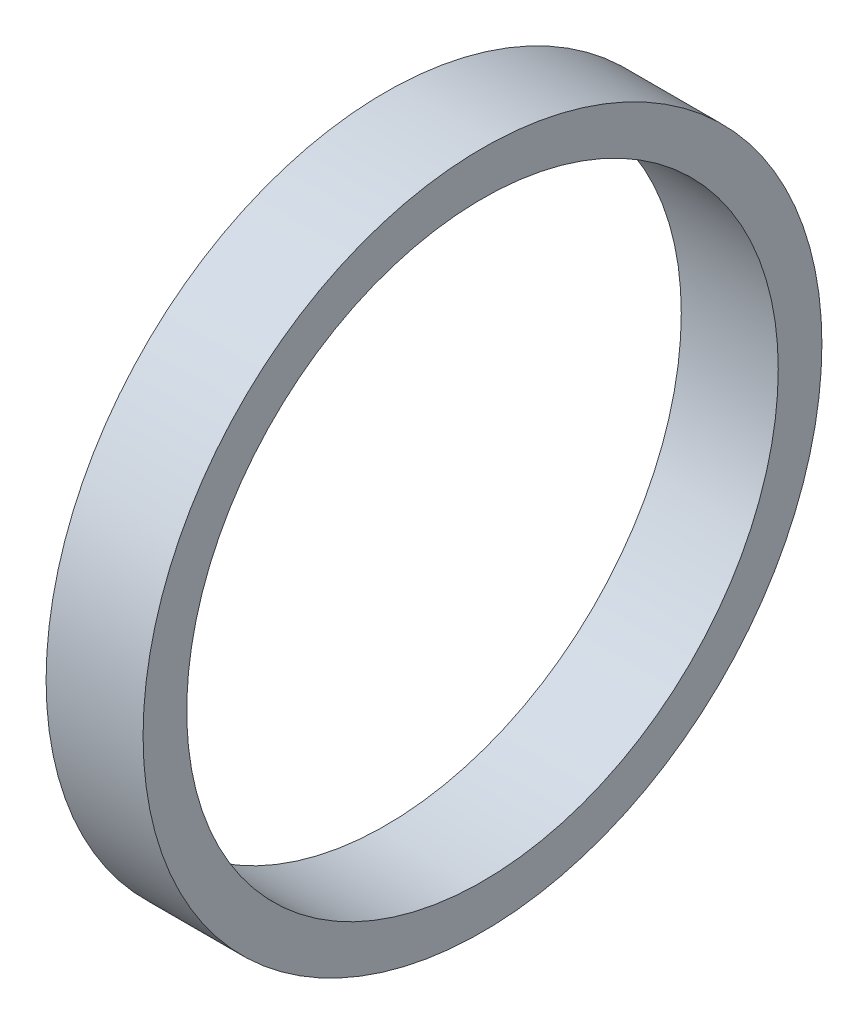
ISO-10303-21;
HEADER;
FILE_DESCRIPTION(('STEP AP214'),'2;1');
FILE_NAME('part.step','',(''),(''),'','','');
FILE_SCHEMA(('AUTOMOTIVE_DESIGN { 1 0 10303 214 1 1 1 1 }'));
ENDSEC;
DATA;
#1=APPLICATION_CONTEXT('core data for automotive mechanical design processes');
#2=APPLICATION_PROTOCOL_DEFINITION('international standard','automotive_design',2000,#1);
#3=PRODUCT_CONTEXT('',#1,'mechanical');
#4=PRODUCT('Part','Part','',(#3));
#5=PRODUCT_RELATED_PRODUCT_CATEGORY('part','',(#4));
#6=PRODUCT_DEFINITION_FORMATION('','',#4);
#7=PRODUCT_DEFINITION_CONTEXT('part definition',#1,'design');
#8=PRODUCT_DEFINITION('design','',#6,#7);
#9=PRODUCT_DEFINITION_SHAPE('','',#8);
#10=(LENGTH_UNIT() NAMED_UNIT(*) SI_UNIT(.MILLI.,.METRE.));
#11=(NAMED_UNIT(*) PLANE_ANGLE_UNIT() SI_UNIT($,.RADIAN.));
#12=(NAMED_UNIT(*) SI_UNIT($,.STERADIAN.) SOLID_ANGLE_UNIT());
#13=UNCERTAINTY_MEASURE_WITH_UNIT(LENGTH_MEASURE(1.E-05),#10,'distance_accuracy_value','');
#14=(GEOMETRIC_REPRESENTATION_CONTEXT(3) GLOBAL_UNCERTAINTY_ASSIGNED_CONTEXT((#13)) GLOBAL_UNIT_ASSIGNED_CONTEXT((#10,
#11,#12)) REPRESENTATION_CONTEXT('',''));
#15=CARTESIAN_POINT('',(0.,0.,0.));
#16=DIRECTION('',(0.,0.,1.));
#17=DIRECTION('',(1.,0.,0.));
#18=AXIS2_PLACEMENT_3D('',#15,#16,#17);
#19=CARTESIAN_POINT('',(1.,0.,0.));
#20=DIRECTION('',(1.,0.,0.));
#21=DIRECTION('',(0.,0.,-1.));
#22=AXIS2_PLACEMENT_3D('',#19,#20,#21);
#23=PLANE('',#22);
#24=CARTESIAN_POINT('',(1.,0.,0.));
#25=DIRECTION('',(1.,0.,0.));
#26=DIRECTION('',(0.,0.,-1.));
#27=AXIS2_PLACEMENT_3D('',#24,#25,#26);
#28=CIRCLE('',#27,3.5);
#29=CARTESIAN_POINT('',(1.,0.,-3.5));
#30=VERTEX_POINT('',#29);
#31=EDGE_CURVE('E10',#30,#30,#28,.T.);
#32=ORIENTED_EDGE('',*,*,#31,.T.);
#33=EDGE_LOOP('',(#32));
#34=FACE_BOUND('',#33,.T.);
#35=CARTESIAN_POINT('',(1.,0.,0.));
#36=DIRECTION('',(1.,0.,0.));
#37=DIRECTION('',(0.,0.,-1.));
#38=AXIS2_PLACEMENT_3D('',#35,#36,#37);
#39=CIRCLE('',#38,3.05);
#40=CARTESIAN_POINT('',(1.,0.,-3.05));
#41=VERTEX_POINT('',#40);
#42=EDGE_CURVE('E50',#41,#41,#39,.T.);
#43=ORIENTED_EDGE('',*,*,#42,.F.);
#44=EDGE_LOOP('',(#43));
#45=FACE_BOUND('',#44,.T.);
#46=ADVANCED_FACE('F39',(#34,#45),#23,.T.);
#47=CARTESIAN_POINT('',(0.,0.,0.));
#48=DIRECTION('',(1.,0.,0.));
#49=DIRECTION('',(0.,0.,-1.));
#50=AXIS2_PLACEMENT_3D('',#47,#48,#49);
#51=PLANE('',#50);
#52=CARTESIAN_POINT('',(0.,0.,0.));
#53=DIRECTION('',(1.,0.,0.));
#54=DIRECTION('',(0.,0.,-1.));
#55=AXIS2_PLACEMENT_3D('',#52,#53,#54);
#56=CIRCLE('',#55,3.5);
#57=CARTESIAN_POINT('',(0.,0.,-3.5));
#58=VERTEX_POINT('',#57);
#59=EDGE_CURVE('E43',#58,#58,#56,.T.);
#60=ORIENTED_EDGE('',*,*,#59,.F.);
#61=EDGE_LOOP('',(#60));
#62=FACE_BOUND('',#61,.T.);
#63=CARTESIAN_POINT('',(0.,0.,0.));
#64=DIRECTION('',(1.,0.,0.));
#65=DIRECTION('',(0.,0.,-1.));
#66=AXIS2_PLACEMENT_3D('',#63,#64,#65);
#67=CIRCLE('',#66,3.05);
#68=CARTESIAN_POINT('',(0.,0.,-3.05));
#69=VERTEX_POINT('',#68);
#70=EDGE_CURVE('E52',#69,#69,#67,.T.);
#71=ORIENTED_EDGE('',*,*,#70,.T.);
#72=EDGE_LOOP('',(#71));
#73=FACE_BOUND('',#72,.T.);
#74=ADVANCED_FACE('F62',(#62,#73),#51,.F.);
#75=CARTESIAN_POINT('',(1.,0.,0.));
#76=DIRECTION('',(-1.,0.,0.));
#77=DIRECTION('',(0.,0.,1.));
#78=AXIS2_PLACEMENT_3D('',#75,#76,#77);
#79=CYLINDRICAL_SURFACE('',#78,3.5);
#80=ORIENTED_EDGE('',*,*,#31,.F.);
#81=EDGE_LOOP('',(#80));
#82=FACE_BOUND('',#81,.T.);
#83=ORIENTED_EDGE('',*,*,#59,.T.);
#84=EDGE_LOOP('',(#83));
#85=FACE_BOUND('',#84,.T.);
#86=ADVANCED_FACE('F41',(#82,#85),#79,.T.);
#87=CARTESIAN_POINT('',(1.,0.,0.));
#88=DIRECTION('',(-1.,0.,0.));
#89=DIRECTION('',(0.,0.,1.));
#90=AXIS2_PLACEMENT_3D('',#87,#88,#89);
#91=CYLINDRICAL_SURFACE('',#90,3.05);
#92=ORIENTED_EDGE('',*,*,#42,.T.);
#93=EDGE_LOOP('',(#92));
#94=FACE_BOUND('',#93,.T.);
#95=ORIENTED_EDGE('',*,*,#70,.F.);
#96=EDGE_LOOP('',(#95));
#97=FACE_BOUND('',#96,.T.);
#98=ADVANCED_FACE('F58',(#94,#97),#91,.F.);
#99=CLOSED_SHELL('',(#46,#74,#86,#98));
#100=MANIFOLD_SOLID_BREP('B2',#99);
#101=ADVANCED_BREP_SHAPE_REPRESENTATION('',(#18,#100),#14);
#102=SHAPE_DEFINITION_REPRESENTATION(#9,#101);
ENDSEC;
END-ISO-10303-21;
